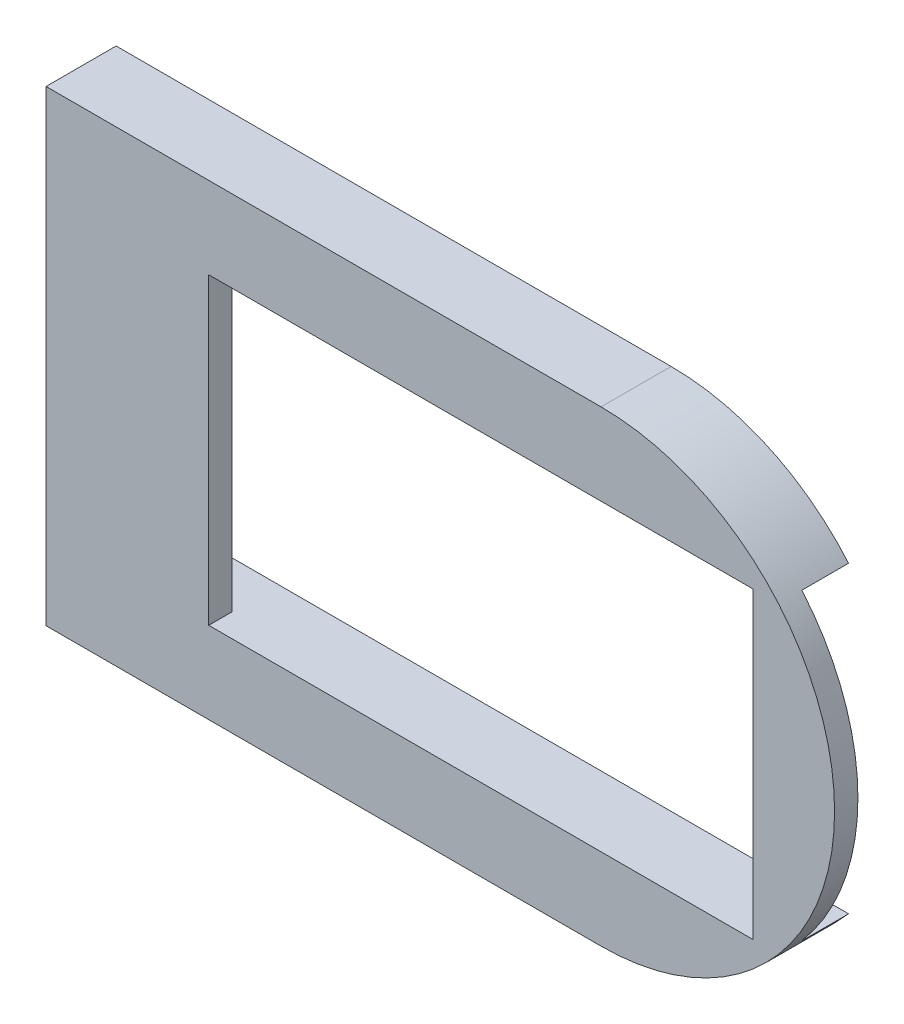
ISO-10303-21;
HEADER;
FILE_DESCRIPTION(('STEP AP214'),'2;1');
FILE_NAME('part.step','',(''),(''),'','','');
FILE_SCHEMA(('AUTOMOTIVE_DESIGN { 1 0 10303 214 1 1 1 1 }'));
ENDSEC;
DATA;
#1=APPLICATION_CONTEXT('core data for automotive mechanical design processes');
#2=APPLICATION_PROTOCOL_DEFINITION('international standard','automotive_design',2000,#1);
#3=PRODUCT_CONTEXT('',#1,'mechanical');
#4=PRODUCT('Part','Part','',(#3));
#5=PRODUCT_RELATED_PRODUCT_CATEGORY('part','',(#4));
#6=PRODUCT_DEFINITION_FORMATION('','',#4);
#7=PRODUCT_DEFINITION_CONTEXT('part definition',#1,'design');
#8=PRODUCT_DEFINITION('design','',#6,#7);
#9=PRODUCT_DEFINITION_SHAPE('','',#8);
#10=(LENGTH_UNIT() NAMED_UNIT(*) SI_UNIT(.MILLI.,.METRE.));
#11=(NAMED_UNIT(*) PLANE_ANGLE_UNIT() SI_UNIT($,.RADIAN.));
#12=(NAMED_UNIT(*) SI_UNIT($,.STERADIAN.) SOLID_ANGLE_UNIT());
#13=UNCERTAINTY_MEASURE_WITH_UNIT(LENGTH_MEASURE(1.E-05),#10,'distance_accuracy_value','');
#14=(GEOMETRIC_REPRESENTATION_CONTEXT(3) GLOBAL_UNCERTAINTY_ASSIGNED_CONTEXT((#13)) GLOBAL_UNIT_ASSIGNED_CONTEXT((#10,
#11,#12)) REPRESENTATION_CONTEXT('',''));
#15=CARTESIAN_POINT('',(0.,0.,0.));
#16=DIRECTION('',(0.,0.,1.));
#17=DIRECTION('',(1.,0.,0.));
#18=AXIS2_PLACEMENT_3D('',#15,#16,#17);
#19=CARTESIAN_POINT('',(0.,10.,0.));
#20=DIRECTION('',(0.,1.,0.));
#21=DIRECTION('',(0.,0.,1.));
#22=AXIS2_PLACEMENT_3D('',#19,#20,#21);
#23=PLANE('',#22);
#24=DIRECTION('',(-1.,0.,0.));
#25=VECTOR('',#24,1.);
#26=CARTESIAN_POINT('',(0.,10.,18.5));
#27=LINE('',#26,#25);
#28=CARTESIAN_POINT('',(80.,10.,18.5));
#29=VERTEX_POINT('',#28);
#30=CARTESIAN_POINT('',(56.234631092849,10.,18.5));
#31=VERTEX_POINT('',#30);
#32=EDGE_CURVE('E534',#29,#31,#27,.T.);
#33=ORIENTED_EDGE('',*,*,#32,.T.);
#34=DIRECTION('',(0.,0.,1.));
#35=VECTOR('',#34,1.);
#36=CARTESIAN_POINT('',(56.234631092849,10.,0.));
#37=LINE('',#36,#35);
#38=CARTESIAN_POINT('',(56.234631092849,10.,21.5));
#39=VERTEX_POINT('',#38);
#40=EDGE_CURVE('E521',#31,#39,#37,.T.);
#41=ORIENTED_EDGE('',*,*,#40,.T.);
#42=DIRECTION('',(-1.,0.,0.));
#43=VECTOR('',#42,1.);
#44=CARTESIAN_POINT('',(0.,10.,21.5));
#45=LINE('',#44,#43);
#46=CARTESIAN_POINT('',(80.,10.,21.5));
#47=VERTEX_POINT('',#46);
#48=EDGE_CURVE('E647',#47,#39,#45,.T.);
#49=ORIENTED_EDGE('',*,*,#48,.F.);
#50=DIRECTION('',(0.,0.,-1.));
#51=VECTOR('',#50,1.);
#52=CARTESIAN_POINT('',(80.,10.,15.));
#53=LINE('',#52,#51);
#54=EDGE_CURVE('E541',#47,#29,#53,.T.);
#55=ORIENTED_EDGE('',*,*,#54,.T.);
#56=EDGE_LOOP('',(#33,#41,#49,#55));
#57=FACE_BOUND('',#56,.T.);
#58=ADVANCED_FACE('F422',(#57),#23,.T.);
#59=CARTESIAN_POINT('',(0.,-10.,0.));
#60=DIRECTION('',(0.,1.,0.));
#61=DIRECTION('',(0.,0.,1.));
#62=AXIS2_PLACEMENT_3D('',#59,#60,#61);
#63=PLANE('',#62);
#64=DIRECTION('',(0.,0.,1.));
#65=VECTOR('',#64,1.);
#66=CARTESIAN_POINT('',(56.234631092849,-10.,0.));
#67=LINE('',#66,#65);
#68=CARTESIAN_POINT('',(56.234631092849,-10.,18.5));
#69=VERTEX_POINT('',#68);
#70=CARTESIAN_POINT('',(56.234631092849,-10.,21.5));
#71=VERTEX_POINT('',#70);
#72=EDGE_CURVE('E437',#69,#71,#67,.T.);
#73=ORIENTED_EDGE('',*,*,#72,.F.);
#74=DIRECTION('',(-1.,0.,0.));
#75=VECTOR('',#74,1.);
#76=CARTESIAN_POINT('',(0.,-10.,18.5));
#77=LINE('',#76,#75);
#78=CARTESIAN_POINT('',(80.,-10.,18.5));
#79=VERTEX_POINT('',#78);
#80=EDGE_CURVE('E538',#79,#69,#77,.T.);
#81=ORIENTED_EDGE('',*,*,#80,.F.);
#82=DIRECTION('',(0.,0.,-1.));
#83=VECTOR('',#82,1.);
#84=CARTESIAN_POINT('',(80.,-10.,15.));
#85=LINE('',#84,#83);
#86=CARTESIAN_POINT('',(80.,-10.,21.5));
#87=VERTEX_POINT('',#86);
#88=EDGE_CURVE('E595',#87,#79,#85,.T.);
#89=ORIENTED_EDGE('',*,*,#88,.F.);
#90=DIRECTION('',(-1.,0.,0.));
#91=VECTOR('',#90,1.);
#92=CARTESIAN_POINT('',(0.,-10.,21.5));
#93=LINE('',#92,#91);
#94=EDGE_CURVE('E546',#87,#71,#93,.T.);
#95=ORIENTED_EDGE('',*,*,#94,.T.);
#96=EDGE_LOOP('',(#73,#81,#89,#95));
#97=FACE_BOUND('',#96,.T.);
#98=ADVANCED_FACE('F424',(#97),#63,.F.);
#99=CARTESIAN_POINT('',(0.,0.,18.5));
#100=DIRECTION('',(0.,0.,-1.));
#101=DIRECTION('',(-1.,0.,0.));
#102=AXIS2_PLACEMENT_3D('',#99,#100,#101);
#103=PLANE('',#102);
#104=ORIENTED_EDGE('',*,*,#80,.T.);
#105=DIRECTION('',(0.,-1.,0.));
#106=VECTOR('',#105,1.);
#107=CARTESIAN_POINT('',(56.234631092849,12.2820946537168,18.5));
#108=LINE('',#107,#106);
#109=EDGE_CURVE('E524',#31,#69,#108,.T.);
#110=ORIENTED_EDGE('',*,*,#109,.F.);
#111=ORIENTED_EDGE('',*,*,#32,.F.);
#112=CARTESIAN_POINT('',(80.,0.,18.5));
#113=DIRECTION('',(0.,0.,-1.));
#114=DIRECTION('',(-1.,0.,0.));
#115=AXIS2_PLACEMENT_3D('',#112,#113,#114);
#116=CIRCLE('',#115,10.);
#117=CARTESIAN_POINT('',(87.5993420767853,6.50000000000001,18.5));
#118=VERTEX_POINT('',#117);
#119=EDGE_CURVE('E542',#118,#29,#116,.F.);
#120=ORIENTED_EDGE('',*,*,#119,.F.);
#121=DIRECTION('',(-1.,0.,0.));
#122=VECTOR('',#121,1.);
#123=CARTESIAN_POINT('',(0.,6.49999999999999,18.5));
#124=LINE('',#123,#122);
#125=CARTESIAN_POINT('',(58.35,6.5,18.5));
#126=VERTEX_POINT('',#125);
#127=EDGE_CURVE('E552',#118,#126,#124,.T.);
#128=ORIENTED_EDGE('',*,*,#127,.T.);
#129=DIRECTION('',(0.,-1.,0.));
#130=VECTOR('',#129,1.);
#131=CARTESIAN_POINT('',(58.35,0.,18.5));
#132=LINE('',#131,#130);
#133=CARTESIAN_POINT('',(58.35,-6.1,18.5));
#134=VERTEX_POINT('',#133);
#135=EDGE_CURVE('E554',#126,#134,#132,.T.);
#136=ORIENTED_EDGE('',*,*,#135,.T.);
#137=DIRECTION('',(1.,0.,0.));
#138=VECTOR('',#137,1.);
#139=CARTESIAN_POINT('',(0.,-6.1,18.5));
#140=LINE('',#139,#138);
#141=CARTESIAN_POINT('',(58.85,-6.1,18.5));
#142=VERTEX_POINT('',#141);
#143=EDGE_CURVE('E556',#134,#142,#140,.T.);
#144=ORIENTED_EDGE('',*,*,#143,.T.);
#145=DIRECTION('',(0.,1.,0.));
#146=VECTOR('',#145,1.);
#147=CARTESIAN_POINT('',(58.85,-6.49999999999999,18.5));
#148=LINE('',#147,#146);
#149=CARTESIAN_POINT('',(58.85,-6.5,18.5));
#150=VERTEX_POINT('',#149);
#151=EDGE_CURVE('E558',#150,#142,#148,.T.);
#152=ORIENTED_EDGE('',*,*,#151,.F.);
#153=DIRECTION('',(1.,0.,0.));
#154=VECTOR('',#153,1.);
#155=CARTESIAN_POINT('',(86.5,-6.5,18.5));
#156=LINE('',#155,#154);
#157=CARTESIAN_POINT('',(87.5993420767853,-6.5,18.5));
#158=VERTEX_POINT('',#157);
#159=EDGE_CURVE('E550',#150,#158,#156,.T.);
#160=ORIENTED_EDGE('',*,*,#159,.T.);
#161=EDGE_CURVE('E544',#79,#158,#116,.F.);
#162=ORIENTED_EDGE('',*,*,#161,.F.);
#163=EDGE_LOOP('',(#104,#110,#111,#120,#128,#136,#144,#152,#160,#162));
#164=FACE_BOUND('',#163,.T.);
#165=ADVANCED_FACE('F533',(#164),#103,.T.);
#166=CARTESIAN_POINT('',(0.,0.,21.5));
#167=DIRECTION('',(0.,0.,-1.));
#168=DIRECTION('',(-1.,0.,0.));
#169=AXIS2_PLACEMENT_3D('',#166,#167,#168);
#170=PLANE('',#169);
#171=DIRECTION('',(1.,0.,0.));
#172=VECTOR('',#171,1.);
#173=CARTESIAN_POINT('',(86.5,-6.5,21.5));
#174=LINE('',#173,#172);
#175=CARTESIAN_POINT('',(63.2,-6.5,21.5));
#176=VERTEX_POINT('',#175);
#177=CARTESIAN_POINT('',(86.5,-6.5,21.5));
#178=VERTEX_POINT('',#177);
#179=EDGE_CURVE('E445',#176,#178,#174,.T.);
#180=ORIENTED_EDGE('',*,*,#179,.F.);
#181=DIRECTION('',(0.,-1.,0.));
#182=VECTOR('',#181,1.);
#183=CARTESIAN_POINT('',(63.2,6.5,21.5));
#184=LINE('',#183,#182);
#185=CARTESIAN_POINT('',(63.2,6.5,21.5));
#186=VERTEX_POINT('',#185);
#187=EDGE_CURVE('E431',#186,#176,#184,.T.);
#188=ORIENTED_EDGE('',*,*,#187,.F.);
#189=DIRECTION('',(-1.,0.,0.));
#190=VECTOR('',#189,1.);
#191=CARTESIAN_POINT('',(0.,6.49999999999999,21.5));
#192=LINE('',#191,#190);
#193=CARTESIAN_POINT('',(86.5,6.5,21.5));
#194=VERTEX_POINT('',#193);
#195=EDGE_CURVE('E643',#194,#186,#192,.T.);
#196=ORIENTED_EDGE('',*,*,#195,.F.);
#197=DIRECTION('',(0.,1.,0.));
#198=VECTOR('',#197,1.);
#199=CARTESIAN_POINT('',(86.5,6.5,21.5));
#200=LINE('',#199,#198);
#201=EDGE_CURVE('E645',#178,#194,#200,.T.);
#202=ORIENTED_EDGE('',*,*,#201,.F.);
#203=EDGE_LOOP('',(#180,#188,#196,#202));
#204=FACE_BOUND('',#203,.T.);
#205=DIRECTION('',(0.,1.,0.));
#206=VECTOR('',#205,1.);
#207=CARTESIAN_POINT('',(56.234631092849,0.,21.5));
#208=LINE('',#207,#206);
#209=EDGE_CURVE('E15',#71,#39,#208,.T.);
#210=ORIENTED_EDGE('',*,*,#209,.F.);
#211=ORIENTED_EDGE('',*,*,#94,.F.);
#212=CARTESIAN_POINT('',(80.,0.,21.5));
#213=DIRECTION('',(0.,0.,-1.));
#214=DIRECTION('',(-1.,0.,0.));
#215=AXIS2_PLACEMENT_3D('',#212,#213,#214);
#216=CIRCLE('',#215,10.);
#217=EDGE_CURVE('E652',#87,#47,#216,.F.);
#218=ORIENTED_EDGE('',*,*,#217,.T.);
#219=ORIENTED_EDGE('',*,*,#48,.T.);
#220=EDGE_LOOP('',(#210,#211,#218,#219));
#221=FACE_BOUND('',#220,.T.);
#222=ADVANCED_FACE('F658',(#204,#221),#170,.F.);
#223=CARTESIAN_POINT('',(0.,-6.1,-46.8236464708841));
#224=DIRECTION('',(0.,-1.,0.));
#225=DIRECTION('',(0.,0.,-1.));
#226=AXIS2_PLACEMENT_3D('',#223,#224,#225);
#227=PLANE('',#226);
#228=ORIENTED_EDGE('',*,*,#143,.F.);
#229=DIRECTION('',(0.,0.,1.));
#230=VECTOR('',#229,1.);
#231=CARTESIAN_POINT('',(58.35,-6.1,-46.8236464708841));
#232=LINE('',#231,#230);
#233=CARTESIAN_POINT('',(58.35,-6.1,20.5));
#234=VERTEX_POINT('',#233);
#235=EDGE_CURVE('E592',#134,#234,#232,.T.);
#236=ORIENTED_EDGE('',*,*,#235,.T.);
#237=DIRECTION('',(1.,0.,0.));
#238=VECTOR('',#237,1.);
#239=CARTESIAN_POINT('',(0.,-6.1,20.5));
#240=LINE('',#239,#238);
#241=CARTESIAN_POINT('',(58.85,-6.1,20.5));
#242=VERTEX_POINT('',#241);
#243=EDGE_CURVE('E585',#234,#242,#240,.T.);
#244=ORIENTED_EDGE('',*,*,#243,.T.);
#245=DIRECTION('',(0.,0.,1.));
#246=VECTOR('',#245,1.);
#247=CARTESIAN_POINT('',(58.85,-6.1,-46.8236464708841));
#248=LINE('',#247,#246);
#249=EDGE_CURVE('E572',#142,#242,#248,.T.);
#250=ORIENTED_EDGE('',*,*,#249,.F.);
#251=EDGE_LOOP('',(#228,#236,#244,#250));
#252=FACE_BOUND('',#251,.T.);
#253=ADVANCED_FACE('F631',(#252),#227,.F.);
#254=CARTESIAN_POINT('',(80.,0.,23.5));
#255=DIRECTION('',(0.,0.,-1.));
#256=DIRECTION('',(-1.,0.,0.));
#257=AXIS2_PLACEMENT_3D('',#254,#255,#256);
#258=CYLINDRICAL_SURFACE('',#257,10.);
#259=ORIENTED_EDGE('',*,*,#217,.F.);
#260=ORIENTED_EDGE('',*,*,#88,.T.);
#261=ORIENTED_EDGE('',*,*,#161,.T.);
#262=DIRECTION('',(0.,0.,-1.));
#263=VECTOR('',#262,1.);
#264=CARTESIAN_POINT('',(87.5993420767853,-6.5,23.5));
#265=LINE('',#264,#263);
#266=CARTESIAN_POINT('',(87.5993420767853,-6.5,20.5));
#267=VERTEX_POINT('',#266);
#268=EDGE_CURVE('E570',#158,#267,#265,.F.);
#269=ORIENTED_EDGE('',*,*,#268,.T.);
#270=CARTESIAN_POINT('',(80.,0.,20.5));
#271=DIRECTION('',(0.,0.,1.));
#272=DIRECTION('',(1.,0.,0.));
#273=AXIS2_PLACEMENT_3D('',#270,#271,#272);
#274=CIRCLE('',#273,10.);
#275=CARTESIAN_POINT('',(87.5993420767853,6.5,20.5));
#276=VERTEX_POINT('',#275);
#277=EDGE_CURVE('E598',#276,#267,#274,.F.);
#278=ORIENTED_EDGE('',*,*,#277,.F.);
#279=DIRECTION('',(0.,0.,-1.));
#280=VECTOR('',#279,1.);
#281=CARTESIAN_POINT('',(87.5993420767853,6.5,23.5));
#282=LINE('',#281,#280);
#283=EDGE_CURVE('E602',#118,#276,#282,.F.);
#284=ORIENTED_EDGE('',*,*,#283,.F.);
#285=ORIENTED_EDGE('',*,*,#119,.T.);
#286=ORIENTED_EDGE('',*,*,#54,.F.);
#287=EDGE_LOOP('',(#259,#260,#261,#269,#278,#284,#285,#286));
#288=FACE_BOUND('',#287,.T.);
#289=ADVANCED_FACE('F660',(#288),#258,.T.);
#290=CARTESIAN_POINT('',(58.35,0.,-46.8236464708841));
#291=DIRECTION('',(-1.,0.,0.));
#292=DIRECTION('',(0.,0.,1.));
#293=AXIS2_PLACEMENT_3D('',#290,#291,#292);
#294=PLANE('',#293);
#295=ORIENTED_EDGE('',*,*,#135,.F.);
#296=DIRECTION('',(0.,0.,1.));
#297=VECTOR('',#296,1.);
#298=CARTESIAN_POINT('',(58.35,6.5,-46.8236464708841));
#299=LINE('',#298,#297);
#300=CARTESIAN_POINT('',(58.35,6.5,20.5));
#301=VERTEX_POINT('',#300);
#302=EDGE_CURVE('E593',#126,#301,#299,.T.);
#303=ORIENTED_EDGE('',*,*,#302,.T.);
#304=DIRECTION('',(0.,-1.,0.));
#305=VECTOR('',#304,1.);
#306=CARTESIAN_POINT('',(58.35,0.,20.5));
#307=LINE('',#306,#305);
#308=EDGE_CURVE('E577',#301,#234,#307,.T.);
#309=ORIENTED_EDGE('',*,*,#308,.T.);
#310=ORIENTED_EDGE('',*,*,#235,.F.);
#311=EDGE_LOOP('',(#295,#303,#309,#310));
#312=FACE_BOUND('',#311,.T.);
#313=ADVANCED_FACE('F637',(#312),#294,.F.);
#314=CARTESIAN_POINT('',(0.,6.49999999999999,-46.8236464708841));
#315=DIRECTION('',(0.,1.,0.));
#316=DIRECTION('',(-1.,0.,0.));
#317=AXIS2_PLACEMENT_3D('',#314,#315,#316);
#318=PLANE('',#317);
#319=DIRECTION('',(0.,0.,-1.));
#320=VECTOR('',#319,1.);
#321=CARTESIAN_POINT('',(86.5,6.5,23.5));
#322=LINE('',#321,#320);
#323=CARTESIAN_POINT('',(86.5,6.5,20.5));
#324=VERTEX_POINT('',#323);
#325=EDGE_CURVE('E575',#194,#324,#322,.T.);
#326=ORIENTED_EDGE('',*,*,#325,.F.);
#327=ORIENTED_EDGE('',*,*,#195,.T.);
#328=DIRECTION('',(0.,0.,-1.));
#329=VECTOR('',#328,1.);
#330=CARTESIAN_POINT('',(63.2,6.5,23.5));
#331=LINE('',#330,#329);
#332=CARTESIAN_POINT('',(63.2,6.5,20.5));
#333=VERTEX_POINT('',#332);
#334=EDGE_CURVE('E578',#186,#333,#331,.T.);
#335=ORIENTED_EDGE('',*,*,#334,.T.);
#336=DIRECTION('',(-1.,0.,0.));
#337=VECTOR('',#336,1.);
#338=CARTESIAN_POINT('',(0.,6.50000000000002,20.5));
#339=LINE('',#338,#337);
#340=EDGE_CURVE('E588',#333,#301,#339,.T.);
#341=ORIENTED_EDGE('',*,*,#340,.T.);
#342=ORIENTED_EDGE('',*,*,#302,.F.);
#343=ORIENTED_EDGE('',*,*,#127,.F.);
#344=ORIENTED_EDGE('',*,*,#283,.T.);
#345=EDGE_CURVE('E589',#276,#324,#339,.T.);
#346=ORIENTED_EDGE('',*,*,#345,.T.);
#347=EDGE_LOOP('',(#326,#327,#335,#341,#342,#343,#344,#346));
#348=FACE_BOUND('',#347,.T.);
#349=ADVANCED_FACE('F642',(#348),#318,.F.);
#350=CARTESIAN_POINT('',(86.5,-6.5,23.5));
#351=DIRECTION('',(0.,-1.,0.));
#352=DIRECTION('',(0.,0.,-1.));
#353=AXIS2_PLACEMENT_3D('',#350,#351,#352);
#354=PLANE('',#353);
#355=DIRECTION('',(0.,0.,-1.));
#356=VECTOR('',#355,1.);
#357=CARTESIAN_POINT('',(63.2,-6.5,23.5));
#358=LINE('',#357,#356);
#359=CARTESIAN_POINT('',(63.2,-6.49999999999999,20.5));
#360=VERTEX_POINT('',#359);
#361=EDGE_CURVE('E580',#176,#360,#358,.T.);
#362=ORIENTED_EDGE('',*,*,#361,.F.);
#363=ORIENTED_EDGE('',*,*,#179,.T.);
#364=DIRECTION('',(0.,0.,-1.));
#365=VECTOR('',#364,1.);
#366=CARTESIAN_POINT('',(86.5,-6.5,23.5));
#367=LINE('',#366,#365);
#368=CARTESIAN_POINT('',(86.5,-6.5,20.5));
#369=VERTEX_POINT('',#368);
#370=EDGE_CURVE('E574',#178,#369,#367,.T.);
#371=ORIENTED_EDGE('',*,*,#370,.T.);
#372=DIRECTION('',(-1.,0.,0.));
#373=VECTOR('',#372,1.);
#374=CARTESIAN_POINT('',(90.85,-6.5,20.5));
#375=LINE('',#374,#373);
#376=EDGE_CURVE('E564',#267,#369,#375,.T.);
#377=ORIENTED_EDGE('',*,*,#376,.F.);
#378=ORIENTED_EDGE('',*,*,#268,.F.);
#379=ORIENTED_EDGE('',*,*,#159,.F.);
#380=DIRECTION('',(0.,0.,1.));
#381=VECTOR('',#380,1.);
#382=CARTESIAN_POINT('',(58.85,-6.49999999999999,-4.5));
#383=LINE('',#382,#381);
#384=CARTESIAN_POINT('',(58.85,-6.49999999999999,20.5));
#385=VERTEX_POINT('',#384);
#386=EDGE_CURVE('E568',#150,#385,#383,.T.);
#387=ORIENTED_EDGE('',*,*,#386,.T.);
#388=EDGE_CURVE('E561',#360,#385,#375,.T.);
#389=ORIENTED_EDGE('',*,*,#388,.F.);
#390=EDGE_LOOP('',(#362,#363,#371,#377,#378,#379,#387,#389));
#391=FACE_BOUND('',#390,.T.);
#392=ADVANCED_FACE('F617',(#391),#354,.F.);
#393=CARTESIAN_POINT('',(58.85,-6.49999999999999,-4.5));
#394=DIRECTION('',(1.,0.,0.));
#395=DIRECTION('',(0.,1.,0.));
#396=AXIS2_PLACEMENT_3D('',#393,#394,#395);
#397=PLANE('',#396);
#398=ORIENTED_EDGE('',*,*,#386,.F.);
#399=ORIENTED_EDGE('',*,*,#151,.T.);
#400=ORIENTED_EDGE('',*,*,#249,.T.);
#401=DIRECTION('',(0.,1.,0.));
#402=VECTOR('',#401,1.);
#403=CARTESIAN_POINT('',(58.85,-6.49999999999999,20.5));
#404=LINE('',#403,#402);
#405=EDGE_CURVE('E565',#385,#242,#404,.T.);
#406=ORIENTED_EDGE('',*,*,#405,.F.);
#407=EDGE_LOOP('',(#398,#399,#400,#406));
#408=FACE_BOUND('',#407,.T.);
#409=ADVANCED_FACE('F627',(#408),#397,.T.);
#410=CARTESIAN_POINT('',(86.5,6.5,23.5));
#411=DIRECTION('',(1.,0.,0.));
#412=DIRECTION('',(0.,0.,-1.));
#413=AXIS2_PLACEMENT_3D('',#410,#411,#412);
#414=PLANE('',#413);
#415=ORIENTED_EDGE('',*,*,#370,.F.);
#416=ORIENTED_EDGE('',*,*,#201,.T.);
#417=ORIENTED_EDGE('',*,*,#325,.T.);
#418=DIRECTION('',(0.,1.,0.));
#419=VECTOR('',#418,1.);
#420=CARTESIAN_POINT('',(86.5,0.,20.5));
#421=LINE('',#420,#419);
#422=EDGE_CURVE('E607',#369,#324,#421,.T.);
#423=ORIENTED_EDGE('',*,*,#422,.F.);
#424=EDGE_LOOP('',(#415,#416,#417,#423));
#425=FACE_BOUND('',#424,.T.);
#426=ADVANCED_FACE('F672',(#425),#414,.F.);
#427=CARTESIAN_POINT('',(63.2,6.5,23.5));
#428=DIRECTION('',(-1.,0.,0.));
#429=DIRECTION('',(0.,0.,1.));
#430=AXIS2_PLACEMENT_3D('',#427,#428,#429);
#431=PLANE('',#430);
#432=ORIENTED_EDGE('',*,*,#334,.F.);
#433=ORIENTED_EDGE('',*,*,#187,.T.);
#434=ORIENTED_EDGE('',*,*,#361,.T.);
#435=DIRECTION('',(0.,-1.,0.));
#436=VECTOR('',#435,1.);
#437=CARTESIAN_POINT('',(63.2,0.,20.5));
#438=LINE('',#437,#436);
#439=EDGE_CURVE('E604',#333,#360,#438,.T.);
#440=ORIENTED_EDGE('',*,*,#439,.F.);
#441=EDGE_LOOP('',(#432,#433,#434,#440));
#442=FACE_BOUND('',#441,.T.);
#443=ADVANCED_FACE('F612',(#442),#431,.F.);
#444=CARTESIAN_POINT('',(0.,0.,20.5));
#445=DIRECTION('',(0.,0.,1.));
#446=DIRECTION('',(1.,0.,0.));
#447=AXIS2_PLACEMENT_3D('',#444,#445,#446);
#448=PLANE('',#447);
#449=ORIENTED_EDGE('',*,*,#277,.T.);
#450=ORIENTED_EDGE('',*,*,#376,.T.);
#451=ORIENTED_EDGE('',*,*,#422,.T.);
#452=ORIENTED_EDGE('',*,*,#345,.F.);
#453=EDGE_LOOP('',(#449,#450,#451,#452));
#454=FACE_BOUND('',#453,.T.);
#455=ADVANCED_FACE('F666',(#454),#448,.F.);
#456=ORIENTED_EDGE('',*,*,#439,.T.);
#457=ORIENTED_EDGE('',*,*,#388,.T.);
#458=ORIENTED_EDGE('',*,*,#405,.T.);
#459=ORIENTED_EDGE('',*,*,#243,.F.);
#460=ORIENTED_EDGE('',*,*,#308,.F.);
#461=ORIENTED_EDGE('',*,*,#340,.F.);
#462=EDGE_LOOP('',(#456,#457,#458,#459,#460,#461));
#463=FACE_BOUND('',#462,.T.);
#464=ADVANCED_FACE('F623',(#463),#448,.F.);
#465=CARTESIAN_POINT('',(56.234631092849,12.2820946537168,18.5));
#466=DIRECTION('',(-1.,0.,0.));
#467=DIRECTION('',(0.,0.,1.));
#468=AXIS2_PLACEMENT_3D('',#465,#466,#467);
#469=PLANE('',#468);
#470=ORIENTED_EDGE('',*,*,#109,.T.);
#471=ORIENTED_EDGE('',*,*,#72,.T.);
#472=ORIENTED_EDGE('',*,*,#209,.T.);
#473=ORIENTED_EDGE('',*,*,#40,.F.);
#474=EDGE_LOOP('',(#470,#471,#472,#473));
#475=FACE_BOUND('',#474,.T.);
#476=ADVANCED_FACE('F523',(#475),#469,.T.);
#477=CLOSED_SHELL('',(#58,#98,#165,#222,#253,#289,#313,#349,#392,#409,#426,#443,#455,#464,#476));
#478=MANIFOLD_SOLID_BREP('B2',#477);
#479=ADVANCED_BREP_SHAPE_REPRESENTATION('',(#18,#478),#14);
#480=SHAPE_DEFINITION_REPRESENTATION(#9,#479);
ENDSEC;
END-ISO-10303-21;
